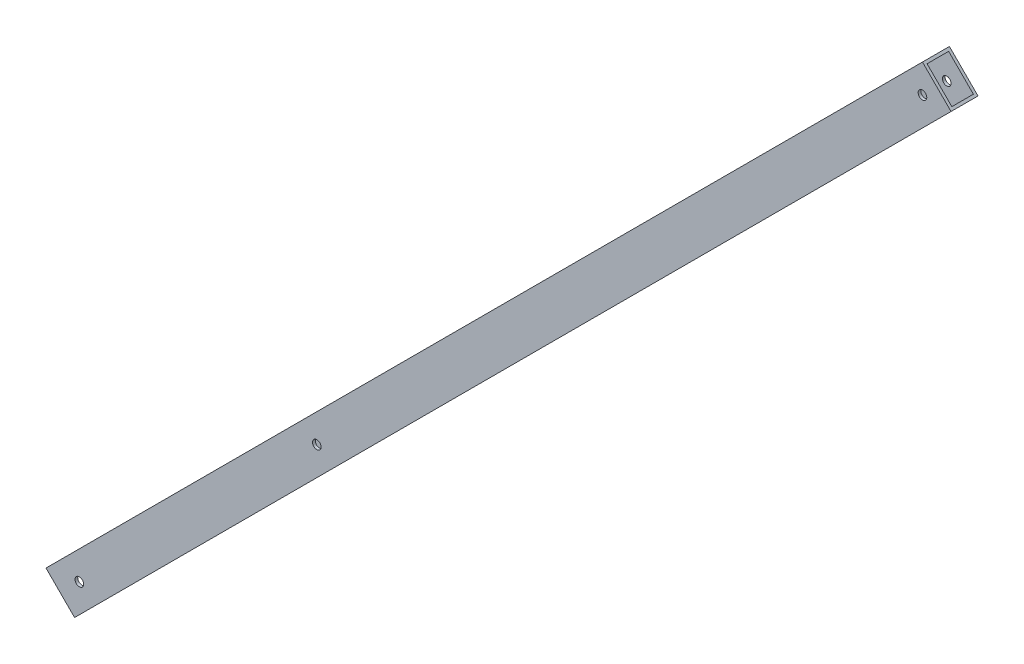
ISO-10303-21;
HEADER;
FILE_DESCRIPTION(('STEP AP214'),'2;1');
FILE_NAME('part.step','',(''),(''),'','','');
FILE_SCHEMA(('AUTOMOTIVE_DESIGN { 1 0 10303 214 1 1 1 1 }'));
ENDSEC;
DATA;
#1=APPLICATION_CONTEXT('core data for automotive mechanical design processes');
#2=APPLICATION_PROTOCOL_DEFINITION('international standard','automotive_design',2000,#1);
#3=PRODUCT_CONTEXT('',#1,'mechanical');
#4=PRODUCT('Part','Part','',(#3));
#5=PRODUCT_RELATED_PRODUCT_CATEGORY('part','',(#4));
#6=PRODUCT_DEFINITION_FORMATION('','',#4);
#7=PRODUCT_DEFINITION_CONTEXT('part definition',#1,'design');
#8=PRODUCT_DEFINITION('design','',#6,#7);
#9=PRODUCT_DEFINITION_SHAPE('','',#8);
#10=(LENGTH_UNIT() NAMED_UNIT(*) SI_UNIT(.MILLI.,.METRE.));
#11=(NAMED_UNIT(*) PLANE_ANGLE_UNIT() SI_UNIT($,.RADIAN.));
#12=(NAMED_UNIT(*) SI_UNIT($,.STERADIAN.) SOLID_ANGLE_UNIT());
#13=UNCERTAINTY_MEASURE_WITH_UNIT(LENGTH_MEASURE(1.E-05),#10,'distance_accuracy_value','');
#14=(GEOMETRIC_REPRESENTATION_CONTEXT(3) GLOBAL_UNCERTAINTY_ASSIGNED_CONTEXT((#13)) GLOBAL_UNIT_ASSIGNED_CONTEXT((#10,
#11,#12)) REPRESENTATION_CONTEXT('',''));
#15=CARTESIAN_POINT('',(0.,0.,0.));
#16=DIRECTION('',(0.,0.,1.));
#17=DIRECTION('',(1.,0.,0.));
#18=AXIS2_PLACEMENT_3D('',#15,#16,#17);
#19=CARTESIAN_POINT('',(100.519119345814,89.9125176280113,10.));
#20=DIRECTION('',(0.,0.,-1.));
#21=DIRECTION('',(-1.,0.,0.));
#22=AXIS2_PLACEMENT_3D('',#19,#20,#21);
#23=CYLINDRICAL_SURFACE('',#22,1.59999999999948);
#24=CARTESIAN_POINT('',(100.519119345814,89.9125176280113,9.));
#25=DIRECTION('',(0.,0.,1.));
#26=DIRECTION('',(1.,0.,0.));
#27=AXIS2_PLACEMENT_3D('',#24,#25,#26);
#28=CIRCLE('',#27,1.59999999999948);
#29=CARTESIAN_POINT('',(102.119119345814,89.9125176280113,9.));
#30=VERTEX_POINT('',#29);
#31=EDGE_CURVE('E155',#30,#30,#28,.T.);
#32=ORIENTED_EDGE('',*,*,#31,.F.);
#33=EDGE_LOOP('',(#32));
#34=FACE_BOUND('',#33,.T.);
#35=CARTESIAN_POINT('',(100.519119345814,89.9125176280113,10.));
#36=DIRECTION('',(0.,0.,1.));
#37=DIRECTION('',(1.,0.,0.));
#38=AXIS2_PLACEMENT_3D('',#35,#36,#37);
#39=CIRCLE('',#38,1.59999999999948);
#40=CARTESIAN_POINT('',(102.119119345814,89.9125176280113,10.));
#41=VERTEX_POINT('',#40);
#42=EDGE_CURVE('E180',#41,#41,#39,.T.);
#43=ORIENTED_EDGE('',*,*,#42,.T.);
#44=EDGE_LOOP('',(#43));
#45=FACE_BOUND('',#44,.T.);
#46=ADVANCED_FACE('F38',(#34,#45),#23,.F.);
#47=CARTESIAN_POINT('',(325.269119345814,314.662517628012,10.));
#48=DIRECTION('',(0.,0.,-1.));
#49=DIRECTION('',(-1.,0.,0.));
#50=AXIS2_PLACEMENT_3D('',#47,#48,#49);
#51=CYLINDRICAL_SURFACE('',#50,1.59999999999996);
#52=CARTESIAN_POINT('',(325.269119345814,314.662517628012,9.));
#53=DIRECTION('',(0.,0.,1.));
#54=DIRECTION('',(1.,0.,0.));
#55=AXIS2_PLACEMENT_3D('',#52,#53,#54);
#56=CIRCLE('',#55,1.59999999999996);
#57=CARTESIAN_POINT('',(326.869119345814,314.662517628012,9.));
#58=VERTEX_POINT('',#57);
#59=EDGE_CURVE('E151',#58,#58,#56,.T.);
#60=ORIENTED_EDGE('',*,*,#59,.F.);
#61=EDGE_LOOP('',(#60));
#62=FACE_BOUND('',#61,.T.);
#63=CARTESIAN_POINT('',(325.269119345814,314.662517628012,10.));
#64=DIRECTION('',(0.,0.,1.));
#65=DIRECTION('',(1.,0.,0.));
#66=AXIS2_PLACEMENT_3D('',#63,#64,#65);
#67=CIRCLE('',#66,1.59999999999996);
#68=CARTESIAN_POINT('',(326.869119345814,314.662517628012,10.));
#69=VERTEX_POINT('',#68);
#70=EDGE_CURVE('E172',#69,#69,#67,.T.);
#71=ORIENTED_EDGE('',*,*,#70,.T.);
#72=EDGE_LOOP('',(#71));
#73=FACE_BOUND('',#72,.T.);
#74=ADVANCED_FACE('F255',(#62,#73),#51,.F.);
#75=CARTESIAN_POINT('',(12.3743686707649,1.76776695296616,10.));
#76=DIRECTION('',(0.,0.,-1.));
#77=DIRECTION('',(-1.,0.,0.));
#78=AXIS2_PLACEMENT_3D('',#75,#76,#77);
#79=CYLINDRICAL_SURFACE('',#78,1.59999999999947);
#80=CARTESIAN_POINT('',(12.3743686707649,1.76776695296616,9.));
#81=DIRECTION('',(0.,0.,1.));
#82=DIRECTION('',(1.,0.,0.));
#83=AXIS2_PLACEMENT_3D('',#80,#81,#82);
#84=CIRCLE('',#83,1.59999999999947);
#85=CARTESIAN_POINT('',(13.9743686707644,1.76776695296616,9.));
#86=VERTEX_POINT('',#85);
#87=EDGE_CURVE('E150',#86,#86,#84,.T.);
#88=ORIENTED_EDGE('',*,*,#87,.F.);
#89=EDGE_LOOP('',(#88));
#90=FACE_BOUND('',#89,.T.);
#91=CARTESIAN_POINT('',(12.3743686707649,1.76776695296616,10.));
#92=DIRECTION('',(0.,0.,1.));
#93=DIRECTION('',(1.,0.,0.));
#94=AXIS2_PLACEMENT_3D('',#91,#92,#93);
#95=CIRCLE('',#94,1.59999999999947);
#96=CARTESIAN_POINT('',(13.9743686707644,1.76776695296616,10.));
#97=VERTEX_POINT('',#96);
#98=EDGE_CURVE('E164',#97,#97,#95,.T.);
#99=ORIENTED_EDGE('',*,*,#98,.T.);
#100=EDGE_LOOP('',(#99));
#101=FACE_BOUND('',#100,.T.);
#102=ADVANCED_FACE('F263',(#90,#101),#79,.F.);
#103=CARTESIAN_POINT('',(0.,0.,10.));
#104=DIRECTION('',(0.,0.,-1.));
#105=DIRECTION('',(-1.,0.,0.));
#106=AXIS2_PLACEMENT_3D('',#103,#104,#105);
#107=PLANE('',#106);
#108=DIRECTION('',(-0.707106781186551,-0.707106781186544,0.));
#109=VECTOR('',#108,1.);
#110=CARTESIAN_POINT('',(0.,0.,10.));
#111=LINE('',#110,#109);
#112=CARTESIAN_POINT('',(325.269119345813,325.26911934581,10.));
#113=VERTEX_POINT('',#112);
#114=CARTESIAN_POINT('',(0.,0.,10.));
#115=VERTEX_POINT('',#114);
#116=EDGE_CURVE('E188',#113,#115,#111,.T.);
#117=ORIENTED_EDGE('',*,*,#116,.T.);
#118=DIRECTION('',(0.707106781186543,-0.707106781186552,0.));
#119=VECTOR('',#118,1.);
#120=CARTESIAN_POINT('',(10.6066017178,-10.6066017178001,10.));
#121=LINE('',#120,#119);
#122=CARTESIAN_POINT('',(10.6066017178,-10.6066017178001,10.));
#123=VERTEX_POINT('',#122);
#124=EDGE_CURVE('E192',#115,#123,#121,.T.);
#125=ORIENTED_EDGE('',*,*,#124,.T.);
#126=DIRECTION('',(0.707106781186547,0.707106781186547,0.));
#127=VECTOR('',#126,1.);
#128=CARTESIAN_POINT('',(335.875721063612,314.662517628012,10.));
#129=LINE('',#128,#127);
#130=CARTESIAN_POINT('',(335.875721063612,314.662517628012,10.));
#131=VERTEX_POINT('',#130);
#132=EDGE_CURVE('E196',#123,#131,#129,.T.);
#133=ORIENTED_EDGE('',*,*,#132,.T.);
#134=DIRECTION('',(-0.707106781186557,0.707106781186538,0.));
#135=VECTOR('',#134,1.);
#136=CARTESIAN_POINT('',(325.269119345813,325.26911934581,10.));
#137=LINE('',#136,#135);
#138=EDGE_CURVE('E199',#131,#113,#137,.T.);
#139=ORIENTED_EDGE('',*,*,#138,.T.);
#140=EDGE_LOOP('',(#117,#125,#133,#139));
#141=FACE_BOUND('',#140,.T.);
#142=ORIENTED_EDGE('',*,*,#42,.F.);
#143=EDGE_LOOP('',(#142));
#144=FACE_BOUND('',#143,.T.);
#145=ORIENTED_EDGE('',*,*,#70,.F.);
#146=EDGE_LOOP('',(#145));
#147=FACE_BOUND('',#146,.T.);
#148=ORIENTED_EDGE('',*,*,#98,.F.);
#149=EDGE_LOOP('',(#148));
#150=FACE_BOUND('',#149,.T.);
#151=ADVANCED_FACE('F287',(#141,#144,#147,#150),#107,.F.);
#152=CARTESIAN_POINT('',(0.,0.,0.));
#153=DIRECTION('',(0.,0.,-1.));
#154=DIRECTION('',(-1.,0.,0.));
#155=AXIS2_PLACEMENT_3D('',#152,#153,#154);
#156=PLANE('',#155);
#157=CARTESIAN_POINT('',(325.269119345814,314.662517628012,0.));
#158=DIRECTION('',(0.,0.,1.));
#159=DIRECTION('',(1.,0.,0.));
#160=AXIS2_PLACEMENT_3D('',#157,#158,#159);
#161=CIRCLE('',#160,1.59999999999996);
#162=CARTESIAN_POINT('',(326.869119345814,314.662517628012,0.));
#163=VERTEX_POINT('',#162);
#164=EDGE_CURVE('E168',#163,#163,#161,.T.);
#165=ORIENTED_EDGE('',*,*,#164,.T.);
#166=EDGE_LOOP('',(#165));
#167=FACE_BOUND('',#166,.T.);
#168=DIRECTION('',(-0.707106781186551,-0.707106781186544,0.));
#169=VECTOR('',#168,1.);
#170=CARTESIAN_POINT('',(0.,0.,0.));
#171=LINE('',#170,#169);
#172=CARTESIAN_POINT('',(325.269119345813,325.26911934581,0.));
#173=VERTEX_POINT('',#172);
#174=CARTESIAN_POINT('',(0.,0.,0.));
#175=VERTEX_POINT('',#174);
#176=EDGE_CURVE('E184',#173,#175,#171,.T.);
#177=ORIENTED_EDGE('',*,*,#176,.F.);
#178=DIRECTION('',(-0.707106781186557,0.707106781186538,0.));
#179=VECTOR('',#178,1.);
#180=CARTESIAN_POINT('',(325.269119345813,325.26911934581,0.));
#181=LINE('',#180,#179);
#182=CARTESIAN_POINT('',(335.875721063612,314.662517628012,0.));
#183=VERTEX_POINT('',#182);
#184=EDGE_CURVE('E193',#183,#173,#181,.T.);
#185=ORIENTED_EDGE('',*,*,#184,.F.);
#186=DIRECTION('',(0.707106781186547,0.707106781186547,0.));
#187=VECTOR('',#186,1.);
#188=CARTESIAN_POINT('',(335.875721063612,314.662517628012,0.));
#189=LINE('',#188,#187);
#190=CARTESIAN_POINT('',(10.6066017178,-10.6066017178001,0.));
#191=VERTEX_POINT('',#190);
#192=EDGE_CURVE('E209',#191,#183,#189,.T.);
#193=ORIENTED_EDGE('',*,*,#192,.F.);
#194=DIRECTION('',(0.707106781186543,-0.707106781186552,0.));
#195=VECTOR('',#194,1.);
#196=CARTESIAN_POINT('',(10.6066017178,-10.6066017178001,0.));
#197=LINE('',#196,#195);
#198=EDGE_CURVE('E206',#175,#191,#197,.T.);
#199=ORIENTED_EDGE('',*,*,#198,.F.);
#200=EDGE_LOOP('',(#177,#185,#193,#199));
#201=FACE_BOUND('',#200,.T.);
#202=CARTESIAN_POINT('',(100.519119345814,89.9125176280113,0.));
#203=DIRECTION('',(0.,0.,1.));
#204=DIRECTION('',(1.,0.,0.));
#205=AXIS2_PLACEMENT_3D('',#202,#203,#204);
#206=CIRCLE('',#205,1.59999999999948);
#207=CARTESIAN_POINT('',(102.119119345814,89.9125176280113,0.));
#208=VERTEX_POINT('',#207);
#209=EDGE_CURVE('E176',#208,#208,#206,.T.);
#210=ORIENTED_EDGE('',*,*,#209,.T.);
#211=EDGE_LOOP('',(#210));
#212=FACE_BOUND('',#211,.T.);
#213=CARTESIAN_POINT('',(12.3743686707649,1.76776695296616,0.));
#214=DIRECTION('',(0.,0.,1.));
#215=DIRECTION('',(1.,0.,0.));
#216=AXIS2_PLACEMENT_3D('',#213,#214,#215);
#217=CIRCLE('',#216,1.59999999999947);
#218=CARTESIAN_POINT('',(13.9743686707644,1.76776695296616,0.));
#219=VERTEX_POINT('',#218);
#220=EDGE_CURVE('E163',#219,#219,#217,.T.);
#221=ORIENTED_EDGE('',*,*,#220,.T.);
#222=EDGE_LOOP('',(#221));
#223=FACE_BOUND('',#222,.T.);
#224=ADVANCED_FACE('F284',(#167,#201,#212,#223),#156,.T.);
#225=CARTESIAN_POINT('',(0.,0.,10.));
#226=DIRECTION('',(0.707106781186544,-0.707106781186551,0.));
#227=DIRECTION('',(0.707106781186551,0.707106781186544,0.));
#228=AXIS2_PLACEMENT_3D('',#225,#226,#227);
#229=PLANE('',#228);
#230=ORIENTED_EDGE('',*,*,#176,.T.);
#231=DIRECTION('',(0.,0.,-1.));
#232=VECTOR('',#231,1.);
#233=CARTESIAN_POINT('',(0.,0.,10.));
#234=LINE('',#233,#232);
#235=EDGE_CURVE('E225',#115,#175,#234,.T.);
#236=ORIENTED_EDGE('',*,*,#235,.F.);
#237=ORIENTED_EDGE('',*,*,#116,.F.);
#238=DIRECTION('',(0.,0.,-1.));
#239=VECTOR('',#238,1.);
#240=CARTESIAN_POINT('',(325.269119345813,325.26911934581,10.));
#241=LINE('',#240,#239);
#242=EDGE_CURVE('E202',#113,#173,#241,.T.);
#243=ORIENTED_EDGE('',*,*,#242,.T.);
#244=EDGE_LOOP('',(#230,#236,#237,#243));
#245=FACE_BOUND('',#244,.T.);
#246=ADVANCED_FACE('F40',(#245),#229,.F.);
#247=CARTESIAN_POINT('',(10.6066017178,-10.6066017178001,10.));
#248=DIRECTION('',(0.707106781186552,0.707106781186543,0.));
#249=DIRECTION('',(-0.707106781186543,0.707106781186552,0.));
#250=AXIS2_PLACEMENT_3D('',#247,#248,#249);
#251=PLANE('',#250);
#252=DIRECTION('',(0.707106781186543,-0.707106781186552,0.));
#253=VECTOR('',#252,1.);
#254=CARTESIAN_POINT('',(0.707106781186543,-0.707106781186552,1.));
#255=LINE('',#254,#253);
#256=CARTESIAN_POINT('',(0.707106781186543,-0.707106781186552,0.999999999999999));
#257=VERTEX_POINT('',#256);
#258=CARTESIAN_POINT('',(9.89949493661343,-9.89949493661354,1.));
#259=VERTEX_POINT('',#258);
#260=EDGE_CURVE('E116',#257,#259,#255,.T.);
#261=ORIENTED_EDGE('',*,*,#260,.F.);
#262=DIRECTION('',(0.,0.,-1.));
#263=VECTOR('',#262,1.);
#264=CARTESIAN_POINT('',(0.707106781186543,-0.707106781186552,9.));
#265=LINE('',#264,#263);
#266=CARTESIAN_POINT('',(0.707106781186543,-0.707106781186552,9.));
#267=VERTEX_POINT('',#266);
#268=EDGE_CURVE('E54',#267,#257,#265,.T.);
#269=ORIENTED_EDGE('',*,*,#268,.F.);
#270=DIRECTION('',(-0.707106781186543,0.707106781186552,0.));
#271=VECTOR('',#270,1.);
#272=CARTESIAN_POINT('',(9.89949493661343,-9.89949493661354,9.));
#273=LINE('',#272,#271);
#274=CARTESIAN_POINT('',(9.89949493661343,-9.89949493661354,9.));
#275=VERTEX_POINT('',#274);
#276=EDGE_CURVE('E124',#275,#267,#273,.T.);
#277=ORIENTED_EDGE('',*,*,#276,.F.);
#278=DIRECTION('',(0.,0.,1.));
#279=VECTOR('',#278,1.);
#280=CARTESIAN_POINT('',(9.89949493661343,-9.89949493661354,1.));
#281=LINE('',#280,#279);
#282=EDGE_CURVE('E107',#259,#275,#281,.T.);
#283=ORIENTED_EDGE('',*,*,#282,.F.);
#284=EDGE_LOOP('',(#261,#269,#277,#283));
#285=FACE_BOUND('',#284,.T.);
#286=ORIENTED_EDGE('',*,*,#198,.T.);
#287=DIRECTION('',(0.,0.,-1.));
#288=VECTOR('',#287,1.);
#289=CARTESIAN_POINT('',(10.6066017178,-10.6066017178001,10.));
#290=LINE('',#289,#288);
#291=EDGE_CURVE('E221',#123,#191,#290,.T.);
#292=ORIENTED_EDGE('',*,*,#291,.F.);
#293=ORIENTED_EDGE('',*,*,#124,.F.);
#294=ORIENTED_EDGE('',*,*,#235,.T.);
#295=EDGE_LOOP('',(#286,#292,#293,#294));
#296=FACE_BOUND('',#295,.T.);
#297=ADVANCED_FACE('F121',(#285,#296),#251,.F.);
#298=CARTESIAN_POINT('',(335.875721063612,314.662517628012,10.));
#299=DIRECTION('',(-0.707106781186547,0.707106781186548,0.));
#300=DIRECTION('',(-0.707106781186548,-0.707106781186547,0.));
#301=AXIS2_PLACEMENT_3D('',#298,#299,#300);
#302=PLANE('',#301);
#303=ORIENTED_EDGE('',*,*,#192,.T.);
#304=DIRECTION('',(0.,0.,-1.));
#305=VECTOR('',#304,1.);
#306=CARTESIAN_POINT('',(335.875721063612,314.662517628012,10.));
#307=LINE('',#306,#305);
#308=EDGE_CURVE('E217',#131,#183,#307,.T.);
#309=ORIENTED_EDGE('',*,*,#308,.F.);
#310=ORIENTED_EDGE('',*,*,#132,.F.);
#311=ORIENTED_EDGE('',*,*,#291,.T.);
#312=EDGE_LOOP('',(#303,#309,#310,#311));
#313=FACE_BOUND('',#312,.T.);
#314=ADVANCED_FACE('F278',(#313),#302,.F.);
#315=CARTESIAN_POINT('',(325.269119345813,325.26911934581,10.));
#316=DIRECTION('',(-0.707106781186538,-0.707106781186557,0.));
#317=DIRECTION('',(0.707106781186557,-0.707106781186538,0.));
#318=AXIS2_PLACEMENT_3D('',#315,#316,#317);
#319=PLANE('',#318);
#320=DIRECTION('',(-0.707106781186557,0.707106781186538,0.));
#321=VECTOR('',#320,1.);
#322=CARTESIAN_POINT('',(325.269119345813,325.26911934581,9.));
#323=LINE('',#322,#321);
#324=CARTESIAN_POINT('',(335.168614282427,315.369624409196,9.));
#325=VERTEX_POINT('',#324);
#326=CARTESIAN_POINT('',(325.976226127,324.562012564623,9.));
#327=VERTEX_POINT('',#326);
#328=EDGE_CURVE('E159',#325,#327,#323,.T.);
#329=ORIENTED_EDGE('',*,*,#328,.T.);
#330=DIRECTION('',(0.,0.,-1.));
#331=VECTOR('',#330,1.);
#332=CARTESIAN_POINT('',(325.976226127,324.562012564623,10.));
#333=LINE('',#332,#331);
#334=CARTESIAN_POINT('',(325.976226127,324.562012564623,1.));
#335=VERTEX_POINT('',#334);
#336=EDGE_CURVE('E11',#327,#335,#333,.T.);
#337=ORIENTED_EDGE('',*,*,#336,.T.);
#338=DIRECTION('',(0.707106781186557,-0.707106781186538,0.));
#339=VECTOR('',#338,1.);
#340=CARTESIAN_POINT('',(325.269119345813,325.26911934581,0.999999999999999));
#341=LINE('',#340,#339);
#342=CARTESIAN_POINT('',(335.168614282427,315.369624409196,1.));
#343=VERTEX_POINT('',#342);
#344=EDGE_CURVE('E147',#335,#343,#341,.T.);
#345=ORIENTED_EDGE('',*,*,#344,.T.);
#346=DIRECTION('',(0.,0.,1.));
#347=VECTOR('',#346,1.);
#348=CARTESIAN_POINT('',(335.168614282427,315.369624409196,10.));
#349=LINE('',#348,#347);
#350=EDGE_CURVE('E47',#343,#325,#349,.T.);
#351=ORIENTED_EDGE('',*,*,#350,.T.);
#352=EDGE_LOOP('',(#329,#337,#345,#351));
#353=FACE_BOUND('',#352,.T.);
#354=ORIENTED_EDGE('',*,*,#184,.T.);
#355=ORIENTED_EDGE('',*,*,#242,.F.);
#356=ORIENTED_EDGE('',*,*,#138,.F.);
#357=ORIENTED_EDGE('',*,*,#308,.T.);
#358=EDGE_LOOP('',(#354,#355,#356,#357));
#359=FACE_BOUND('',#358,.T.);
#360=ADVANCED_FACE('F236',(#353,#359),#319,.F.);
#361=CARTESIAN_POINT('',(100.519119345814,89.9125176280113,0.999999999999999));
#362=DIRECTION('',(0.,0.,-1.));
#363=DIRECTION('',(-1.,0.,0.));
#364=AXIS2_PLACEMENT_3D('',#361,#362,#363);
#365=CIRCLE('',#364,1.59999999999948);
#366=CARTESIAN_POINT('',(98.9191193458147,89.9125176280113,0.999999999999999));
#367=VERTEX_POINT('',#366);
#368=EDGE_CURVE('E143',#367,#367,#365,.T.);
#369=ORIENTED_EDGE('',*,*,#368,.F.);
#370=EDGE_LOOP('',(#369));
#371=FACE_BOUND('',#370,.T.);
#372=ORIENTED_EDGE('',*,*,#209,.F.);
#373=EDGE_LOOP('',(#372));
#374=FACE_BOUND('',#373,.T.);
#375=ADVANCED_FACE('F258',(#371,#374),#23,.F.);
#376=CARTESIAN_POINT('',(325.269119345814,314.662517628012,0.999999999999999));
#377=DIRECTION('',(0.,0.,-1.));
#378=DIRECTION('',(-1.,0.,0.));
#379=AXIS2_PLACEMENT_3D('',#376,#377,#378);
#380=CIRCLE('',#379,1.59999999999996);
#381=CARTESIAN_POINT('',(323.669119345814,314.662517628012,0.999999999999999));
#382=VERTEX_POINT('',#381);
#383=EDGE_CURVE('E139',#382,#382,#380,.T.);
#384=ORIENTED_EDGE('',*,*,#383,.F.);
#385=EDGE_LOOP('',(#384));
#386=FACE_BOUND('',#385,.T.);
#387=ORIENTED_EDGE('',*,*,#164,.F.);
#388=EDGE_LOOP('',(#387));
#389=FACE_BOUND('',#388,.T.);
#390=ADVANCED_FACE('F266',(#386,#389),#51,.F.);
#391=CARTESIAN_POINT('',(12.3743686707649,1.76776695296616,0.999999999999999));
#392=DIRECTION('',(0.,0.,-1.));
#393=DIRECTION('',(-1.,0.,0.));
#394=AXIS2_PLACEMENT_3D('',#391,#392,#393);
#395=CIRCLE('',#394,1.59999999999947);
#396=CARTESIAN_POINT('',(10.7743686707654,1.76776695296616,0.999999999999999));
#397=VERTEX_POINT('',#396);
#398=EDGE_CURVE('E134',#397,#397,#395,.T.);
#399=ORIENTED_EDGE('',*,*,#398,.F.);
#400=EDGE_LOOP('',(#399));
#401=FACE_BOUND('',#400,.T.);
#402=ORIENTED_EDGE('',*,*,#220,.F.);
#403=EDGE_LOOP('',(#402));
#404=FACE_BOUND('',#403,.T.);
#405=ADVANCED_FACE('F276',(#401,#404),#79,.F.);
#406=CARTESIAN_POINT('',(707.813887967738,706.399674405357,9.));
#407=DIRECTION('',(-0.707106781186543,0.707106781186552,0.));
#408=DIRECTION('',(-0.707106781186552,-0.707106781186543,0.));
#409=AXIS2_PLACEMENT_3D('',#406,#407,#408);
#410=PLANE('',#409);
#411=DIRECTION('',(-0.707106781186552,-0.707106781186543,0.));
#412=VECTOR('',#411,1.);
#413=CARTESIAN_POINT('',(707.813887967738,706.399674405357,9.));
#414=LINE('',#413,#412);
#415=EDGE_CURVE('E131',#327,#267,#414,.T.);
#416=ORIENTED_EDGE('',*,*,#415,.T.);
#417=ORIENTED_EDGE('',*,*,#268,.T.);
#418=DIRECTION('',(-0.707106781186552,-0.707106781186543,0.));
#419=VECTOR('',#418,1.);
#420=CARTESIAN_POINT('',(707.813887967738,706.399674405357,1.));
#421=LINE('',#420,#419);
#422=EDGE_CURVE('E113',#335,#257,#421,.T.);
#423=ORIENTED_EDGE('',*,*,#422,.F.);
#424=ORIENTED_EDGE('',*,*,#336,.F.);
#425=EDGE_LOOP('',(#416,#417,#423,#424));
#426=FACE_BOUND('',#425,.T.);
#427=ADVANCED_FACE('F238',(#426),#410,.F.);
#428=CARTESIAN_POINT('',(717.006276123165,697.20728624993,1.));
#429=DIRECTION('',(0.707106781186543,-0.707106781186552,0.));
#430=DIRECTION('',(0.707106781186552,0.707106781186543,0.));
#431=AXIS2_PLACEMENT_3D('',#428,#429,#430);
#432=PLANE('',#431);
#433=DIRECTION('',(-0.707106781186552,-0.707106781186543,0.));
#434=VECTOR('',#433,1.);
#435=CARTESIAN_POINT('',(717.006276123165,697.20728624993,1.));
#436=LINE('',#435,#434);
#437=EDGE_CURVE('E62',#343,#259,#436,.T.);
#438=ORIENTED_EDGE('',*,*,#437,.T.);
#439=ORIENTED_EDGE('',*,*,#282,.T.);
#440=DIRECTION('',(-0.707106781186552,-0.707106781186543,0.));
#441=VECTOR('',#440,1.);
#442=CARTESIAN_POINT('',(717.006276123165,697.20728624993,9.));
#443=LINE('',#442,#441);
#444=EDGE_CURVE('E112',#325,#275,#443,.T.);
#445=ORIENTED_EDGE('',*,*,#444,.F.);
#446=ORIENTED_EDGE('',*,*,#350,.F.);
#447=EDGE_LOOP('',(#438,#439,#445,#446));
#448=FACE_BOUND('',#447,.T.);
#449=ADVANCED_FACE('F104',(#448),#432,.F.);
#450=CARTESIAN_POINT('',(717.006276123165,697.20728624993,9.));
#451=DIRECTION('',(0.,0.,1.));
#452=DIRECTION('',(1.,0.,0.));
#453=AXIS2_PLACEMENT_3D('',#450,#451,#452);
#454=PLANE('',#453);
#455=ORIENTED_EDGE('',*,*,#31,.T.);
#456=EDGE_LOOP('',(#455));
#457=FACE_BOUND('',#456,.T.);
#458=ORIENTED_EDGE('',*,*,#59,.T.);
#459=EDGE_LOOP('',(#458));
#460=FACE_BOUND('',#459,.T.);
#461=ORIENTED_EDGE('',*,*,#87,.T.);
#462=EDGE_LOOP('',(#461));
#463=FACE_BOUND('',#462,.T.);
#464=ORIENTED_EDGE('',*,*,#444,.T.);
#465=ORIENTED_EDGE('',*,*,#276,.T.);
#466=ORIENTED_EDGE('',*,*,#415,.F.);
#467=ORIENTED_EDGE('',*,*,#328,.F.);
#468=EDGE_LOOP('',(#464,#465,#466,#467));
#469=FACE_BOUND('',#468,.T.);
#470=ADVANCED_FACE('F241',(#457,#460,#463,#469),#454,.F.);
#471=CARTESIAN_POINT('',(707.813887967738,706.399674405357,1.));
#472=DIRECTION('',(0.,0.,-1.));
#473=DIRECTION('',(-1.,0.,0.));
#474=AXIS2_PLACEMENT_3D('',#471,#472,#473);
#475=PLANE('',#474);
#476=ORIENTED_EDGE('',*,*,#368,.T.);
#477=EDGE_LOOP('',(#476));
#478=FACE_BOUND('',#477,.T.);
#479=ORIENTED_EDGE('',*,*,#383,.T.);
#480=EDGE_LOOP('',(#479));
#481=FACE_BOUND('',#480,.T.);
#482=ORIENTED_EDGE('',*,*,#398,.T.);
#483=EDGE_LOOP('',(#482));
#484=FACE_BOUND('',#483,.T.);
#485=ORIENTED_EDGE('',*,*,#422,.T.);
#486=ORIENTED_EDGE('',*,*,#260,.T.);
#487=ORIENTED_EDGE('',*,*,#437,.F.);
#488=ORIENTED_EDGE('',*,*,#344,.F.);
#489=EDGE_LOOP('',(#485,#486,#487,#488));
#490=FACE_BOUND('',#489,.T.);
#491=ADVANCED_FACE('F117',(#478,#481,#484,#490),#475,.F.);
#492=CLOSED_SHELL('',(#46,#74,#102,#151,#224,#246,#297,#314,#360,#375,#390,#405,#427,#449,#470,#491));
#493=MANIFOLD_SOLID_BREP('B2',#492);
#494=ADVANCED_BREP_SHAPE_REPRESENTATION('',(#18,#493),#14);
#495=SHAPE_DEFINITION_REPRESENTATION(#9,#494);
ENDSEC;
END-ISO-10303-21;
